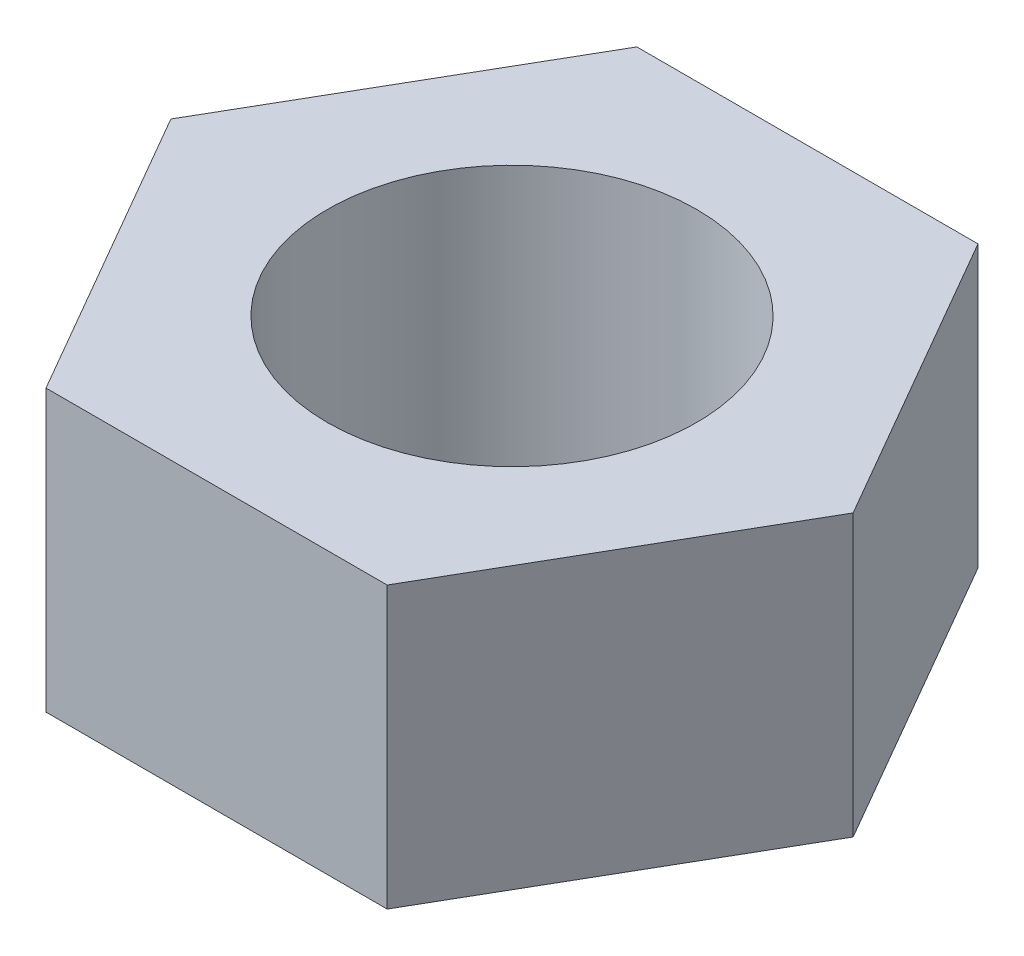
ISO-10303-21;
HEADER;
FILE_DESCRIPTION(('STEP AP214'),'2;1');
FILE_NAME('part.step','',(''),(''),'','','');
FILE_SCHEMA(('AUTOMOTIVE_DESIGN { 1 0 10303 214 1 1 1 1 }'));
ENDSEC;
DATA;
#1=APPLICATION_CONTEXT('core data for automotive mechanical design processes');
#2=APPLICATION_PROTOCOL_DEFINITION('international standard','automotive_design',2000,#1);
#3=PRODUCT_CONTEXT('',#1,'mechanical');
#4=PRODUCT('Part','Part','',(#3));
#5=PRODUCT_RELATED_PRODUCT_CATEGORY('part','',(#4));
#6=PRODUCT_DEFINITION_FORMATION('','',#4);
#7=PRODUCT_DEFINITION_CONTEXT('part definition',#1,'design');
#8=PRODUCT_DEFINITION('design','',#6,#7);
#9=PRODUCT_DEFINITION_SHAPE('','',#8);
#10=(LENGTH_UNIT() NAMED_UNIT(*) SI_UNIT(.MILLI.,.METRE.));
#11=(NAMED_UNIT(*) PLANE_ANGLE_UNIT() SI_UNIT($,.RADIAN.));
#12=(NAMED_UNIT(*) SI_UNIT($,.STERADIAN.) SOLID_ANGLE_UNIT());
#13=UNCERTAINTY_MEASURE_WITH_UNIT(LENGTH_MEASURE(1.E-05),#10,'distance_accuracy_value','');
#14=(GEOMETRIC_REPRESENTATION_CONTEXT(3) GLOBAL_UNCERTAINTY_ASSIGNED_CONTEXT((#13)) GLOBAL_UNIT_ASSIGNED_CONTEXT((#10,
#11,#12)) REPRESENTATION_CONTEXT('',''));
#15=CARTESIAN_POINT('',(0.,0.,0.));
#16=DIRECTION('',(0.,0.,1.));
#17=DIRECTION('',(1.,0.,0.));
#18=AXIS2_PLACEMENT_3D('',#15,#16,#17);
#19=CARTESIAN_POINT('',(2.30940107675848,3.8,4.00000000000002));
#20=DIRECTION('',(-0.866025403784439,0.,-0.5));
#21=DIRECTION('',(-0.5,0.,0.866025403784439));
#22=AXIS2_PLACEMENT_3D('',#19,#20,#21);
#23=PLANE('',#22);
#24=DIRECTION('',(0.5,0.,-0.866025403784439));
#25=VECTOR('',#24,1.);
#26=CARTESIAN_POINT('',(2.30940107675848,0.,4.00000000000002));
#27=LINE('',#26,#25);
#28=CARTESIAN_POINT('',(2.30940107675848,0.,4.00000000000002));
#29=VERTEX_POINT('',#28);
#30=CARTESIAN_POINT('',(4.618802153517,0.,0.));
#31=VERTEX_POINT('',#30);
#32=EDGE_CURVE('E117',#29,#31,#27,.T.);
#33=ORIENTED_EDGE('',*,*,#32,.T.);
#34=DIRECTION('',(0.,-1.,0.));
#35=VECTOR('',#34,1.);
#36=CARTESIAN_POINT('',(4.618802153517,3.8,0.));
#37=LINE('',#36,#35);
#38=CARTESIAN_POINT('',(4.618802153517,3.8,0.));
#39=VERTEX_POINT('',#38);
#40=EDGE_CURVE('E11',#39,#31,#37,.T.);
#41=ORIENTED_EDGE('',*,*,#40,.F.);
#42=DIRECTION('',(0.5,0.,-0.866025403784439));
#43=VECTOR('',#42,1.);
#44=CARTESIAN_POINT('',(2.30940107675848,3.8,4.00000000000002));
#45=LINE('',#44,#43);
#46=CARTESIAN_POINT('',(2.30940107675848,3.8,4.00000000000002));
#47=VERTEX_POINT('',#46);
#48=EDGE_CURVE('E128',#47,#39,#45,.T.);
#49=ORIENTED_EDGE('',*,*,#48,.F.);
#50=DIRECTION('',(0.,-1.,0.));
#51=VECTOR('',#50,1.);
#52=CARTESIAN_POINT('',(2.30940107675848,3.8,4.00000000000002));
#53=LINE('',#52,#51);
#54=EDGE_CURVE('E113',#47,#29,#53,.T.);
#55=ORIENTED_EDGE('',*,*,#54,.T.);
#56=EDGE_LOOP('',(#33,#41,#49,#55));
#57=FACE_BOUND('',#56,.T.);
#58=ADVANCED_FACE('F33',(#57),#23,.F.);
#59=CARTESIAN_POINT('',(4.618802153517,3.8,0.));
#60=DIRECTION('',(-0.866025403784438,0.,0.500000000000001));
#61=DIRECTION('',(0.500000000000001,0.,0.866025403784438));
#62=AXIS2_PLACEMENT_3D('',#59,#60,#61);
#63=PLANE('',#62);
#64=DIRECTION('',(-0.500000000000002,0.,-0.866025403784438));
#65=VECTOR('',#64,1.);
#66=CARTESIAN_POINT('',(4.618802153517,0.,0.));
#67=LINE('',#66,#65);
#68=CARTESIAN_POINT('',(2.30940107675848,0.,-4.00000000000003));
#69=VERTEX_POINT('',#68);
#70=EDGE_CURVE('E120',#31,#69,#67,.T.);
#71=ORIENTED_EDGE('',*,*,#70,.T.);
#72=DIRECTION('',(0.,-1.,0.));
#73=VECTOR('',#72,1.);
#74=CARTESIAN_POINT('',(2.30940107675848,3.8,-4.00000000000003));
#75=LINE('',#74,#73);
#76=CARTESIAN_POINT('',(2.30940107675848,3.8,-4.00000000000003));
#77=VERTEX_POINT('',#76);
#78=EDGE_CURVE('E41',#77,#69,#75,.T.);
#79=ORIENTED_EDGE('',*,*,#78,.F.);
#80=DIRECTION('',(-0.500000000000002,0.,-0.866025403784438));
#81=VECTOR('',#80,1.);
#82=CARTESIAN_POINT('',(4.618802153517,3.8,0.));
#83=LINE('',#82,#81);
#84=EDGE_CURVE('E86',#39,#77,#83,.T.);
#85=ORIENTED_EDGE('',*,*,#84,.F.);
#86=ORIENTED_EDGE('',*,*,#40,.T.);
#87=EDGE_LOOP('',(#71,#79,#85,#86));
#88=FACE_BOUND('',#87,.T.);
#89=ADVANCED_FACE('F153',(#88),#63,.F.);
#90=CARTESIAN_POINT('',(2.30940107675848,3.8,-4.00000000000003));
#91=DIRECTION('',(0.,0.,1.));
#92=DIRECTION('',(1.,0.,0.));
#93=AXIS2_PLACEMENT_3D('',#90,#91,#92);
#94=PLANE('',#93);
#95=DIRECTION('',(-1.,0.,0.));
#96=VECTOR('',#95,1.);
#97=CARTESIAN_POINT('',(2.30940107675848,0.,-4.00000000000003));
#98=LINE('',#97,#96);
#99=CARTESIAN_POINT('',(-2.3094010767585,0.,-4.00000000000003));
#100=VERTEX_POINT('',#99);
#101=EDGE_CURVE('E123',#69,#100,#98,.T.);
#102=ORIENTED_EDGE('',*,*,#101,.T.);
#103=DIRECTION('',(0.,-1.,0.));
#104=VECTOR('',#103,1.);
#105=CARTESIAN_POINT('',(-2.3094010767585,3.8,-4.00000000000003));
#106=LINE('',#105,#104);
#107=CARTESIAN_POINT('',(-2.3094010767585,3.8,-4.00000000000003));
#108=VERTEX_POINT('',#107);
#109=EDGE_CURVE('E108',#108,#100,#106,.T.);
#110=ORIENTED_EDGE('',*,*,#109,.F.);
#111=DIRECTION('',(-1.,0.,0.));
#112=VECTOR('',#111,1.);
#113=CARTESIAN_POINT('',(2.30940107675848,3.8,-4.00000000000003));
#114=LINE('',#113,#112);
#115=EDGE_CURVE('E99',#77,#108,#114,.T.);
#116=ORIENTED_EDGE('',*,*,#115,.F.);
#117=ORIENTED_EDGE('',*,*,#78,.T.);
#118=EDGE_LOOP('',(#102,#110,#116,#117));
#119=FACE_BOUND('',#118,.T.);
#120=ADVANCED_FACE('F134',(#119),#94,.F.);
#121=CARTESIAN_POINT('',(-2.3094010767585,3.8,-4.00000000000003));
#122=DIRECTION('',(0.866025403784438,0.,0.5));
#123=DIRECTION('',(0.5,0.,-0.866025403784439));
#124=AXIS2_PLACEMENT_3D('',#121,#122,#123);
#125=PLANE('',#124);
#126=DIRECTION('',(-0.5,0.,0.866025403784439));
#127=VECTOR('',#126,1.);
#128=CARTESIAN_POINT('',(-2.3094010767585,0.,-4.00000000000003));
#129=LINE('',#128,#127);
#130=CARTESIAN_POINT('',(-4.61880215351703,0.,0.));
#131=VERTEX_POINT('',#130);
#132=EDGE_CURVE('E107',#100,#131,#129,.T.);
#133=ORIENTED_EDGE('',*,*,#132,.T.);
#134=DIRECTION('',(0.,-1.,0.));
#135=VECTOR('',#134,1.);
#136=CARTESIAN_POINT('',(-4.61880215351703,3.8,0.));
#137=LINE('',#136,#135);
#138=CARTESIAN_POINT('',(-4.61880215351703,3.8,0.));
#139=VERTEX_POINT('',#138);
#140=EDGE_CURVE('E104',#139,#131,#137,.T.);
#141=ORIENTED_EDGE('',*,*,#140,.F.);
#142=DIRECTION('',(-0.5,0.,0.866025403784439));
#143=VECTOR('',#142,1.);
#144=CARTESIAN_POINT('',(-2.3094010767585,3.8,-4.00000000000003));
#145=LINE('',#144,#143);
#146=EDGE_CURVE('E93',#108,#139,#145,.T.);
#147=ORIENTED_EDGE('',*,*,#146,.F.);
#148=ORIENTED_EDGE('',*,*,#109,.T.);
#149=EDGE_LOOP('',(#133,#141,#147,#148));
#150=FACE_BOUND('',#149,.T.);
#151=ADVANCED_FACE('F105',(#150),#125,.F.);
#152=CARTESIAN_POINT('',(-4.61880215351703,3.8,0.));
#153=DIRECTION('',(0.866025403784438,0.,-0.5));
#154=DIRECTION('',(-0.5,0.,-0.866025403784438));
#155=AXIS2_PLACEMENT_3D('',#152,#153,#154);
#156=PLANE('',#155);
#157=DIRECTION('',(0.5,0.,0.866025403784438));
#158=VECTOR('',#157,1.);
#159=CARTESIAN_POINT('',(-4.61880215351703,0.,0.));
#160=LINE('',#159,#158);
#161=CARTESIAN_POINT('',(-2.30940107675852,0.,4.00000000000002));
#162=VERTEX_POINT('',#161);
#163=EDGE_CURVE('E72',#131,#162,#160,.T.);
#164=ORIENTED_EDGE('',*,*,#163,.T.);
#165=DIRECTION('',(0.,-1.,0.));
#166=VECTOR('',#165,1.);
#167=CARTESIAN_POINT('',(-2.30940107675852,3.8,4.00000000000002));
#168=LINE('',#167,#166);
#169=CARTESIAN_POINT('',(-2.30940107675852,3.8,4.00000000000002));
#170=VERTEX_POINT('',#169);
#171=EDGE_CURVE('E109',#170,#162,#168,.T.);
#172=ORIENTED_EDGE('',*,*,#171,.F.);
#173=DIRECTION('',(0.5,0.,0.866025403784438));
#174=VECTOR('',#173,1.);
#175=CARTESIAN_POINT('',(-4.61880215351703,3.8,0.));
#176=LINE('',#175,#174);
#177=EDGE_CURVE('E97',#139,#170,#176,.T.);
#178=ORIENTED_EDGE('',*,*,#177,.F.);
#179=ORIENTED_EDGE('',*,*,#140,.T.);
#180=EDGE_LOOP('',(#164,#172,#178,#179));
#181=FACE_BOUND('',#180,.T.);
#182=ADVANCED_FACE('F111',(#181),#156,.F.);
#183=CARTESIAN_POINT('',(-2.30940107675852,3.8,4.00000000000002));
#184=DIRECTION('',(0.,0.,-1.));
#185=DIRECTION('',(-1.,0.,0.));
#186=AXIS2_PLACEMENT_3D('',#183,#184,#185);
#187=PLANE('',#186);
#188=DIRECTION('',(1.,0.,0.));
#189=VECTOR('',#188,1.);
#190=CARTESIAN_POINT('',(-2.30940107675852,0.,4.00000000000002));
#191=LINE('',#190,#189);
#192=EDGE_CURVE('E78',#162,#29,#191,.T.);
#193=ORIENTED_EDGE('',*,*,#192,.T.);
#194=ORIENTED_EDGE('',*,*,#54,.F.);
#195=DIRECTION('',(1.,0.,0.));
#196=VECTOR('',#195,1.);
#197=CARTESIAN_POINT('',(-2.30940107675852,3.8,4.00000000000002));
#198=LINE('',#197,#196);
#199=EDGE_CURVE('E49',#170,#47,#198,.T.);
#200=ORIENTED_EDGE('',*,*,#199,.F.);
#201=ORIENTED_EDGE('',*,*,#171,.T.);
#202=EDGE_LOOP('',(#193,#194,#200,#201));
#203=FACE_BOUND('',#202,.T.);
#204=ADVANCED_FACE('F141',(#203),#187,.F.);
#205=CARTESIAN_POINT('',(0.,3.8,0.));
#206=DIRECTION('',(0.,1.,0.));
#207=DIRECTION('',(0.,0.,1.));
#208=AXIS2_PLACEMENT_3D('',#205,#206,#207);
#209=PLANE('',#208);
#210=CARTESIAN_POINT('',(0.,3.8,0.));
#211=DIRECTION('',(0.,-1.,0.));
#212=DIRECTION('',(0.,0.,-1.));
#213=AXIS2_PLACEMENT_3D('',#210,#211,#212);
#214=CIRCLE('',#213,2.5);
#215=CARTESIAN_POINT('',(0.,3.8,-2.5));
#216=VERTEX_POINT('',#215);
#217=EDGE_CURVE('E121',#216,#216,#214,.T.);
#218=ORIENTED_EDGE('',*,*,#217,.T.);
#219=EDGE_LOOP('',(#218));
#220=FACE_BOUND('',#219,.T.);
#221=ORIENTED_EDGE('',*,*,#48,.T.);
#222=ORIENTED_EDGE('',*,*,#84,.T.);
#223=ORIENTED_EDGE('',*,*,#115,.T.);
#224=ORIENTED_EDGE('',*,*,#146,.T.);
#225=ORIENTED_EDGE('',*,*,#177,.T.);
#226=ORIENTED_EDGE('',*,*,#199,.T.);
#227=EDGE_LOOP('',(#221,#222,#223,#224,#225,#226));
#228=FACE_BOUND('',#227,.T.);
#229=ADVANCED_FACE('F95',(#220,#228),#209,.T.);
#230=CARTESIAN_POINT('',(0.,0.,0.));
#231=DIRECTION('',(0.,1.,0.));
#232=DIRECTION('',(0.,0.,1.));
#233=AXIS2_PLACEMENT_3D('',#230,#231,#232);
#234=PLANE('',#233);
#235=CARTESIAN_POINT('',(0.,0.,0.));
#236=DIRECTION('',(0.,-1.,0.));
#237=DIRECTION('',(0.,0.,-1.));
#238=AXIS2_PLACEMENT_3D('',#235,#236,#237);
#239=CIRCLE('',#238,2.5);
#240=CARTESIAN_POINT('',(0.,0.,-2.5));
#241=VERTEX_POINT('',#240);
#242=EDGE_CURVE('E208',#241,#241,#239,.T.);
#243=ORIENTED_EDGE('',*,*,#242,.F.);
#244=EDGE_LOOP('',(#243));
#245=FACE_BOUND('',#244,.T.);
#246=ORIENTED_EDGE('',*,*,#32,.F.);
#247=ORIENTED_EDGE('',*,*,#192,.F.);
#248=ORIENTED_EDGE('',*,*,#163,.F.);
#249=ORIENTED_EDGE('',*,*,#132,.F.);
#250=ORIENTED_EDGE('',*,*,#101,.F.);
#251=ORIENTED_EDGE('',*,*,#70,.F.);
#252=EDGE_LOOP('',(#246,#247,#248,#249,#250,#251));
#253=FACE_BOUND('',#252,.T.);
#254=ADVANCED_FACE('F137',(#245,#253),#234,.F.);
#255=CARTESIAN_POINT('',(0.,3.8,0.));
#256=DIRECTION('',(0.,-1.,0.));
#257=DIRECTION('',(0.,0.,-1.));
#258=AXIS2_PLACEMENT_3D('',#255,#256,#257);
#259=CYLINDRICAL_SURFACE('',#258,2.5);
#260=CARTESIAN_POINT('',(0.,3.8,-2.5));
#261=CARTESIAN_POINT('',(0.,3.76041666666667,-2.5));
#262=CARTESIAN_POINT('',(0.,3.72083333333333,-2.5));
#263=CARTESIAN_POINT('',(0.,3.64166666666667,-2.5));
#264=CARTESIAN_POINT('',(0.,3.60208333333333,-2.5));
#265=CARTESIAN_POINT('',(0.,3.52291666666667,-2.5));
#266=CARTESIAN_POINT('',(0.,3.48333333333333,-2.5));
#267=CARTESIAN_POINT('',(0.,3.40416666666667,-2.5));
#268=CARTESIAN_POINT('',(0.,3.36458333333333,-2.5));
#269=CARTESIAN_POINT('',(0.,3.28541666666667,-2.5));
#270=CARTESIAN_POINT('',(0.,3.24583333333333,-2.5));
#271=CARTESIAN_POINT('',(0.,3.16666666666667,-2.5));
#272=CARTESIAN_POINT('',(0.,3.12708333333333,-2.5));
#273=CARTESIAN_POINT('',(0.,3.04791666666667,-2.5));
#274=CARTESIAN_POINT('',(0.,3.00833333333333,-2.5));
#275=CARTESIAN_POINT('',(0.,2.92916666666667,-2.5));
#276=CARTESIAN_POINT('',(0.,2.88958333333333,-2.5));
#277=CARTESIAN_POINT('',(0.,2.81041666666667,-2.5));
#278=CARTESIAN_POINT('',(0.,2.77083333333333,-2.5));
#279=CARTESIAN_POINT('',(0.,2.69166666666667,-2.5));
#280=CARTESIAN_POINT('',(0.,2.65208333333333,-2.5));
#281=CARTESIAN_POINT('',(0.,2.57291666666667,-2.5));
#282=CARTESIAN_POINT('',(0.,2.53333333333333,-2.5));
#283=CARTESIAN_POINT('',(0.,2.45416666666667,-2.5));
#284=CARTESIAN_POINT('',(0.,2.41458333333333,-2.5));
#285=CARTESIAN_POINT('',(0.,2.33541666666667,-2.5));
#286=CARTESIAN_POINT('',(0.,2.29583333333333,-2.5));
#287=CARTESIAN_POINT('',(0.,2.21666666666667,-2.5));
#288=CARTESIAN_POINT('',(0.,2.17708333333333,-2.5));
#289=CARTESIAN_POINT('',(0.,2.09791666666667,-2.5));
#290=CARTESIAN_POINT('',(0.,2.05833333333333,-2.5));
#291=CARTESIAN_POINT('',(0.,1.97916666666667,-2.5));
#292=CARTESIAN_POINT('',(0.,1.93958333333333,-2.5));
#293=CARTESIAN_POINT('',(0.,1.86041666666667,-2.5));
#294=CARTESIAN_POINT('',(0.,1.82083333333333,-2.5));
#295=CARTESIAN_POINT('',(0.,1.74166666666667,-2.5));
#296=CARTESIAN_POINT('',(0.,1.70208333333333,-2.5));
#297=CARTESIAN_POINT('',(0.,1.62291666666667,-2.5));
#298=CARTESIAN_POINT('',(0.,1.58333333333333,-2.5));
#299=CARTESIAN_POINT('',(0.,1.50416666666667,-2.5));
#300=CARTESIAN_POINT('',(0.,1.46458333333333,-2.5));
#301=CARTESIAN_POINT('',(0.,1.38541666666667,-2.5));
#302=CARTESIAN_POINT('',(0.,1.34583333333333,-2.5));
#303=CARTESIAN_POINT('',(0.,1.26666666666667,-2.5));
#304=CARTESIAN_POINT('',(0.,1.22708333333333,-2.5));
#305=CARTESIAN_POINT('',(0.,1.14791666666667,-2.5));
#306=CARTESIAN_POINT('',(0.,1.10833333333333,-2.5));
#307=CARTESIAN_POINT('',(0.,1.02916666666667,-2.5));
#308=CARTESIAN_POINT('',(0.,0.989583333333334,-2.5));
#309=CARTESIAN_POINT('',(0.,0.910416666666667,-2.5));
#310=CARTESIAN_POINT('',(0.,0.870833333333333,-2.5));
#311=CARTESIAN_POINT('',(0.,0.791666666666667,-2.5));
#312=CARTESIAN_POINT('',(0.,0.752083333333333,-2.5));
#313=CARTESIAN_POINT('',(0.,0.672916666666667,-2.5));
#314=CARTESIAN_POINT('',(0.,0.633333333333333,-2.5));
#315=CARTESIAN_POINT('',(0.,0.554166666666667,-2.5));
#316=CARTESIAN_POINT('',(0.,0.514583333333334,-2.5));
#317=CARTESIAN_POINT('',(0.,0.435416666666667,-2.5));
#318=CARTESIAN_POINT('',(0.,0.395833333333334,-2.5));
#319=CARTESIAN_POINT('',(0.,0.316666666666667,-2.5));
#320=CARTESIAN_POINT('',(0.,0.277083333333333,-2.5));
#321=CARTESIAN_POINT('',(0.,0.197916666666667,-2.5));
#322=CARTESIAN_POINT('',(0.,0.158333333333333,-2.5));
#323=CARTESIAN_POINT('',(0.,0.0791666666666666,-2.5));
#324=CARTESIAN_POINT('',(0.,0.0395833333333333,-2.5));
#325=CARTESIAN_POINT('',(0.,0.,-2.5));
#326=B_SPLINE_CURVE_WITH_KNOTS('',3,(#260,#261,#262,#263,#264,#265,#266,#267,#268,#269,#270,
#271,#272,#273,#274,#275,#276,#277,#278,#279,#280,#281,#282,#283,#284,#285,#286,#287,#288,#289,
#290,#291,#292,#293,#294,#295,#296,#297,#298,#299,#300,#301,#302,#303,#304,#305,#306,#307,#308,
#309,#310,#311,#312,#313,#314,#315,#316,#317,#318,#319,#320,#321,#322,#323,#324,#325),
.UNSPECIFIED.,.F.,.F.,(4,2,2,2,2,2,2,2,2,2,2,2,2,2,2,2,2,2,2,2,2,2,2,2,2,2,2,2,2,2,2,2,4),(0.,
0.11875,0.2375,0.35625,0.475,0.59375,0.7125,0.83125,0.95,1.06875,1.1875,1.30625,1.425,1.54375,
1.6625,1.78125,1.9,2.01875,2.1375,2.25625,2.375,2.49375,2.6125,2.73125,2.85,2.96875,3.0875,
3.20625,3.325,3.44375,3.5625,3.68125,3.8),.UNSPECIFIED.);
#327=EDGE_CURVE('BSEAM190',#216,#241,#326,.T.);
#328=ORIENTED_EDGE('',*,*,#217,.F.);
#329=ORIENTED_EDGE('',*,*,#242,.T.);
#330=ORIENTED_EDGE('',*,*,#327,.T.);
#331=ORIENTED_EDGE('',*,*,#327,.F.);
#332=EDGE_LOOP('',(#328,#330,#329,#331));
#333=FACE_BOUND('',#332,.T.);
#334=ADVANCED_FACE('F190',(#333),#259,.F.);
#335=CLOSED_SHELL('',(#58,#89,#120,#151,#182,#204,#229,#254,#334));
#336=MANIFOLD_SOLID_BREP('B2',#335);
#337=ADVANCED_BREP_SHAPE_REPRESENTATION('',(#18,#336),#14);
#338=SHAPE_DEFINITION_REPRESENTATION(#9,#337);
ENDSEC;
END-ISO-10303-21;
